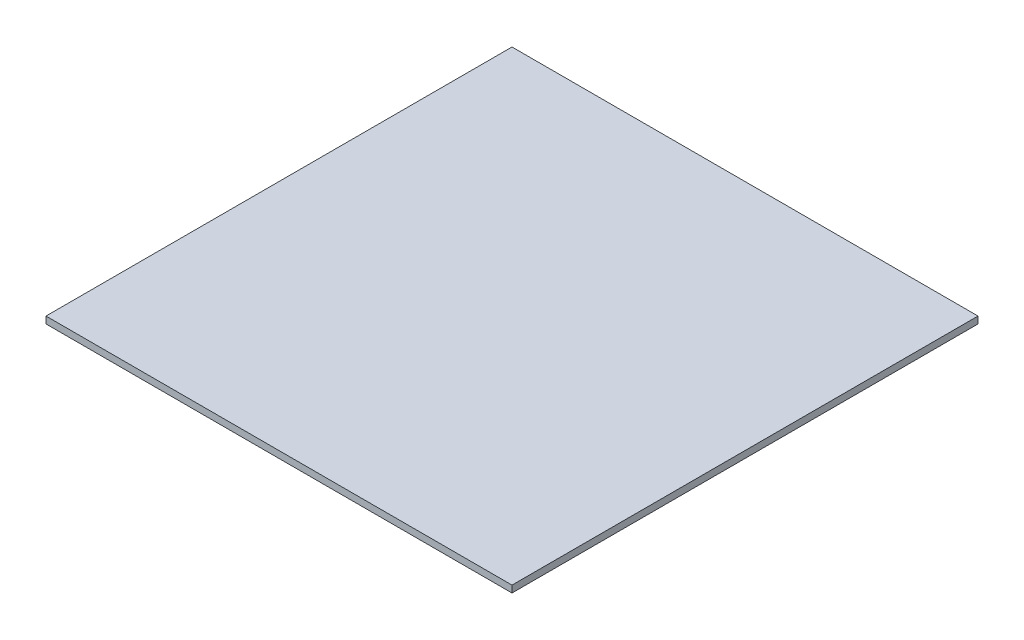
ISO-10303-21;
HEADER;
FILE_DESCRIPTION(('STEP AP214'),'2;1');
FILE_NAME('part.step','',(''),(''),'','','');
FILE_SCHEMA(('AUTOMOTIVE_DESIGN { 1 0 10303 214 1 1 1 1 }'));
ENDSEC;
DATA;
#1=APPLICATION_CONTEXT('core data for automotive mechanical design processes');
#2=APPLICATION_PROTOCOL_DEFINITION('international standard','automotive_design',2000,#1);
#3=PRODUCT_CONTEXT('',#1,'mechanical');
#4=PRODUCT('Part','Part','',(#3));
#5=PRODUCT_RELATED_PRODUCT_CATEGORY('part','',(#4));
#6=PRODUCT_DEFINITION_FORMATION('','',#4);
#7=PRODUCT_DEFINITION_CONTEXT('part definition',#1,'design');
#8=PRODUCT_DEFINITION('design','',#6,#7);
#9=PRODUCT_DEFINITION_SHAPE('','',#8);
#10=(LENGTH_UNIT() NAMED_UNIT(*) SI_UNIT(.MILLI.,.METRE.));
#11=(NAMED_UNIT(*) PLANE_ANGLE_UNIT() SI_UNIT($,.RADIAN.));
#12=(NAMED_UNIT(*) SI_UNIT($,.STERADIAN.) SOLID_ANGLE_UNIT());
#13=UNCERTAINTY_MEASURE_WITH_UNIT(LENGTH_MEASURE(1.E-05),#10,'distance_accuracy_value','');
#14=(GEOMETRIC_REPRESENTATION_CONTEXT(3) GLOBAL_UNCERTAINTY_ASSIGNED_CONTEXT((#13)) GLOBAL_UNIT_ASSIGNED_CONTEXT((#10,
#11,#12)) REPRESENTATION_CONTEXT('',''));
#15=CARTESIAN_POINT('',(0.,0.,0.));
#16=DIRECTION('',(0.,0.,1.));
#17=DIRECTION('',(1.,0.,0.));
#18=AXIS2_PLACEMENT_3D('',#15,#16,#17);
#19=CARTESIAN_POINT('',(305.,9.,-305.));
#20=DIRECTION('',(-1.,0.,0.));
#21=DIRECTION('',(0.,0.,1.));
#22=AXIS2_PLACEMENT_3D('',#19,#20,#21);
#23=PLANE('',#22);
#24=DIRECTION('',(0.,0.,-1.));
#25=VECTOR('',#24,1.);
#26=CARTESIAN_POINT('',(305.,0.,-305.));
#27=LINE('',#26,#25);
#28=CARTESIAN_POINT('',(305.,0.,305.));
#29=VERTEX_POINT('',#28);
#30=CARTESIAN_POINT('',(305.,0.,-305.));
#31=VERTEX_POINT('',#30);
#32=EDGE_CURVE('E103',#29,#31,#27,.T.);
#33=ORIENTED_EDGE('',*,*,#32,.T.);
#34=DIRECTION('',(0.,-1.,0.));
#35=VECTOR('',#34,1.);
#36=CARTESIAN_POINT('',(305.,9.,-305.));
#37=LINE('',#36,#35);
#38=CARTESIAN_POINT('',(305.,9.,-305.));
#39=VERTEX_POINT('',#38);
#40=EDGE_CURVE('E11',#39,#31,#37,.T.);
#41=ORIENTED_EDGE('',*,*,#40,.F.);
#42=DIRECTION('',(0.,0.,-1.));
#43=VECTOR('',#42,1.);
#44=CARTESIAN_POINT('',(305.,9.,-305.));
#45=LINE('',#44,#43);
#46=CARTESIAN_POINT('',(305.,9.,305.));
#47=VERTEX_POINT('',#46);
#48=EDGE_CURVE('E91',#47,#39,#45,.T.);
#49=ORIENTED_EDGE('',*,*,#48,.F.);
#50=DIRECTION('',(0.,-1.,0.));
#51=VECTOR('',#50,1.);
#52=CARTESIAN_POINT('',(305.,9.,305.));
#53=LINE('',#52,#51);
#54=EDGE_CURVE('E99',#47,#29,#53,.T.);
#55=ORIENTED_EDGE('',*,*,#54,.T.);
#56=EDGE_LOOP('',(#33,#41,#49,#55));
#57=FACE_BOUND('',#56,.T.);
#58=ADVANCED_FACE('F40',(#57),#23,.F.);
#59=CARTESIAN_POINT('',(-305.,9.,-305.));
#60=DIRECTION('',(0.,0.,1.));
#61=DIRECTION('',(1.,0.,0.));
#62=AXIS2_PLACEMENT_3D('',#59,#60,#61);
#63=PLANE('',#62);
#64=DIRECTION('',(-1.,0.,0.));
#65=VECTOR('',#64,1.);
#66=CARTESIAN_POINT('',(-305.,0.,-305.));
#67=LINE('',#66,#65);
#68=CARTESIAN_POINT('',(-305.,0.,-305.));
#69=VERTEX_POINT('',#68);
#70=EDGE_CURVE('E95',#31,#69,#67,.T.);
#71=ORIENTED_EDGE('',*,*,#70,.T.);
#72=DIRECTION('',(0.,-1.,0.));
#73=VECTOR('',#72,1.);
#74=CARTESIAN_POINT('',(-305.,9.,-305.));
#75=LINE('',#74,#73);
#76=CARTESIAN_POINT('',(-305.,9.,-305.));
#77=VERTEX_POINT('',#76);
#78=EDGE_CURVE('E48',#77,#69,#75,.T.);
#79=ORIENTED_EDGE('',*,*,#78,.F.);
#80=DIRECTION('',(-1.,0.,0.));
#81=VECTOR('',#80,1.);
#82=CARTESIAN_POINT('',(-305.,9.,-305.));
#83=LINE('',#82,#81);
#84=EDGE_CURVE('E86',#39,#77,#83,.T.);
#85=ORIENTED_EDGE('',*,*,#84,.F.);
#86=ORIENTED_EDGE('',*,*,#40,.T.);
#87=EDGE_LOOP('',(#71,#79,#85,#86));
#88=FACE_BOUND('',#87,.T.);
#89=ADVANCED_FACE('F94',(#88),#63,.F.);
#90=CARTESIAN_POINT('',(-305.,9.,-305.));
#91=DIRECTION('',(1.,0.,0.));
#92=DIRECTION('',(0.,0.,-1.));
#93=AXIS2_PLACEMENT_3D('',#90,#91,#92);
#94=PLANE('',#93);
#95=DIRECTION('',(0.,0.,1.));
#96=VECTOR('',#95,1.);
#97=CARTESIAN_POINT('',(-305.,0.,-305.));
#98=LINE('',#97,#96);
#99=CARTESIAN_POINT('',(-305.,0.,305.));
#100=VERTEX_POINT('',#99);
#101=EDGE_CURVE('E73',#69,#100,#98,.T.);
#102=ORIENTED_EDGE('',*,*,#101,.T.);
#103=DIRECTION('',(0.,-1.,0.));
#104=VECTOR('',#103,1.);
#105=CARTESIAN_POINT('',(-305.,9.,305.));
#106=LINE('',#105,#104);
#107=CARTESIAN_POINT('',(-305.,9.,305.));
#108=VERTEX_POINT('',#107);
#109=EDGE_CURVE('E96',#108,#100,#106,.T.);
#110=ORIENTED_EDGE('',*,*,#109,.F.);
#111=DIRECTION('',(0.,0.,1.));
#112=VECTOR('',#111,1.);
#113=CARTESIAN_POINT('',(-305.,9.,-305.));
#114=LINE('',#113,#112);
#115=EDGE_CURVE('E89',#77,#108,#114,.T.);
#116=ORIENTED_EDGE('',*,*,#115,.F.);
#117=ORIENTED_EDGE('',*,*,#78,.T.);
#118=EDGE_LOOP('',(#102,#110,#116,#117));
#119=FACE_BOUND('',#118,.T.);
#120=ADVANCED_FACE('F97',(#119),#94,.F.);
#121=CARTESIAN_POINT('',(-305.,9.,305.));
#122=DIRECTION('',(0.,0.,-1.));
#123=DIRECTION('',(-1.,0.,0.));
#124=AXIS2_PLACEMENT_3D('',#121,#122,#123);
#125=PLANE('',#124);
#126=DIRECTION('',(1.,0.,0.));
#127=VECTOR('',#126,1.);
#128=CARTESIAN_POINT('',(-305.,0.,305.));
#129=LINE('',#128,#127);
#130=EDGE_CURVE('E79',#100,#29,#129,.T.);
#131=ORIENTED_EDGE('',*,*,#130,.T.);
#132=ORIENTED_EDGE('',*,*,#54,.F.);
#133=DIRECTION('',(1.,0.,0.));
#134=VECTOR('',#133,1.);
#135=CARTESIAN_POINT('',(-305.,9.,305.));
#136=LINE('',#135,#134);
#137=EDGE_CURVE('E56',#108,#47,#136,.T.);
#138=ORIENTED_EDGE('',*,*,#137,.F.);
#139=ORIENTED_EDGE('',*,*,#109,.T.);
#140=EDGE_LOOP('',(#131,#132,#138,#139));
#141=FACE_BOUND('',#140,.T.);
#142=ADVANCED_FACE('F110',(#141),#125,.F.);
#143=CARTESIAN_POINT('',(0.,9.,0.));
#144=DIRECTION('',(0.,1.,0.));
#145=DIRECTION('',(0.,0.,1.));
#146=AXIS2_PLACEMENT_3D('',#143,#144,#145);
#147=PLANE('',#146);
#148=ORIENTED_EDGE('',*,*,#48,.T.);
#149=ORIENTED_EDGE('',*,*,#84,.T.);
#150=ORIENTED_EDGE('',*,*,#115,.T.);
#151=ORIENTED_EDGE('',*,*,#137,.T.);
#152=EDGE_LOOP('',(#148,#149,#150,#151));
#153=FACE_BOUND('',#152,.T.);
#154=ADVANCED_FACE('F87',(#153),#147,.T.);
#155=CARTESIAN_POINT('',(0.,0.,0.));
#156=DIRECTION('',(0.,1.,0.));
#157=DIRECTION('',(0.,0.,1.));
#158=AXIS2_PLACEMENT_3D('',#155,#156,#157);
#159=PLANE('',#158);
#160=ORIENTED_EDGE('',*,*,#32,.F.);
#161=ORIENTED_EDGE('',*,*,#130,.F.);
#162=ORIENTED_EDGE('',*,*,#101,.F.);
#163=ORIENTED_EDGE('',*,*,#70,.F.);
#164=EDGE_LOOP('',(#160,#161,#162,#163));
#165=FACE_BOUND('',#164,.T.);
#166=ADVANCED_FACE('F113',(#165),#159,.F.);
#167=CLOSED_SHELL('',(#58,#89,#120,#142,#154,#166));
#168=MANIFOLD_SOLID_BREP('B2',#167);
#169=ADVANCED_BREP_SHAPE_REPRESENTATION('',(#18,#168),#14);
#170=SHAPE_DEFINITION_REPRESENTATION(#9,#169);
ENDSEC;
END-ISO-10303-21;
